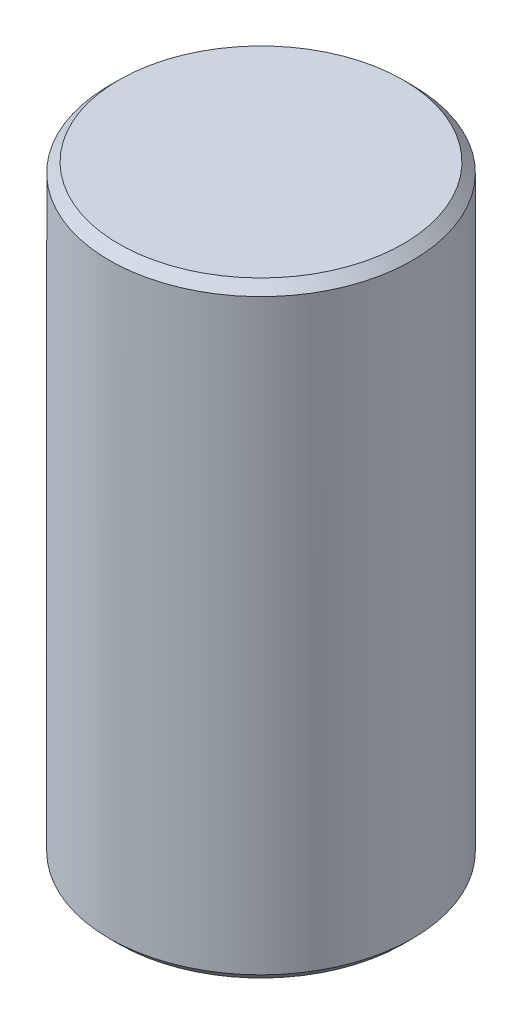
ISO-10303-21;
HEADER;
FILE_DESCRIPTION(('STEP AP214'),'2;1');
FILE_NAME('part.step','',(''),(''),'','','');
FILE_SCHEMA(('AUTOMOTIVE_DESIGN { 1 0 10303 214 1 1 1 1 }'));
ENDSEC;
DATA;
#1=APPLICATION_CONTEXT('core data for automotive mechanical design processes');
#2=APPLICATION_PROTOCOL_DEFINITION('international standard','automotive_design',2000,#1);
#3=PRODUCT_CONTEXT('',#1,'mechanical');
#4=PRODUCT('Part','Part','',(#3));
#5=PRODUCT_RELATED_PRODUCT_CATEGORY('part','',(#4));
#6=PRODUCT_DEFINITION_FORMATION('','',#4);
#7=PRODUCT_DEFINITION_CONTEXT('part definition',#1,'design');
#8=PRODUCT_DEFINITION('design','',#6,#7);
#9=PRODUCT_DEFINITION_SHAPE('','',#8);
#10=(LENGTH_UNIT() NAMED_UNIT(*) SI_UNIT(.MILLI.,.METRE.));
#11=(NAMED_UNIT(*) PLANE_ANGLE_UNIT() SI_UNIT($,.RADIAN.));
#12=(NAMED_UNIT(*) SI_UNIT($,.STERADIAN.) SOLID_ANGLE_UNIT());
#13=UNCERTAINTY_MEASURE_WITH_UNIT(LENGTH_MEASURE(1.E-05),#10,'distance_accuracy_value','');
#14=(GEOMETRIC_REPRESENTATION_CONTEXT(3) GLOBAL_UNCERTAINTY_ASSIGNED_CONTEXT((#13)) GLOBAL_UNIT_ASSIGNED_CONTEXT((#10,
#11,#12)) REPRESENTATION_CONTEXT('',''));
#15=CARTESIAN_POINT('',(0.,0.,0.));
#16=DIRECTION('',(0.,0.,1.));
#17=DIRECTION('',(1.,0.,0.));
#18=AXIS2_PLACEMENT_3D('',#15,#16,#17);
#19=CARTESIAN_POINT('',(0.,25.4,0.));
#20=DIRECTION('',(0.,-1.,0.));
#21=DIRECTION('',(0.,0.,-1.));
#22=AXIS2_PLACEMENT_3D('',#19,#20,#21);
#23=CYLINDRICAL_SURFACE('',#22,6.35);
#24=CARTESIAN_POINT('',(0.,0.396875000000001,0.));
#25=DIRECTION('',(0.,1.,0.));
#26=DIRECTION('',(0.,0.,1.));
#27=AXIS2_PLACEMENT_3D('',#24,#25,#26);
#28=CIRCLE('',#27,6.35);
#29=CARTESIAN_POINT('',(0.,0.396874999999998,-6.35));
#30=VERTEX_POINT('',#29);
#31=EDGE_CURVE('E42',#30,#30,#28,.T.);
#32=CARTESIAN_POINT('',(0.,25.003125,0.));
#33=DIRECTION('',(0.,1.,0.));
#34=DIRECTION('',(0.,0.,1.));
#35=AXIS2_PLACEMENT_3D('',#32,#33,#34);
#36=CIRCLE('',#35,6.35);
#37=CARTESIAN_POINT('',(0.,25.003125,-6.35));
#38=VERTEX_POINT('',#37);
#39=EDGE_CURVE('E46',#38,#38,#36,.F.);
#40=CARTESIAN_POINT('',(0.,0.396874999999998,-6.35));
#41=CARTESIAN_POINT('',(0.,0.653190104166664,-6.35));
#42=CARTESIAN_POINT('',(0.,0.90950520833333,-6.35));
#43=CARTESIAN_POINT('',(0.,1.42213541666666,-6.35));
#44=CARTESIAN_POINT('',(0.,1.67845052083333,-6.35));
#45=CARTESIAN_POINT('',(0.,2.19108072916666,-6.35));
#46=CARTESIAN_POINT('',(0.,2.44739583333333,-6.35));
#47=CARTESIAN_POINT('',(0.,2.96002604166667,-6.35));
#48=CARTESIAN_POINT('',(0.,3.21634114583333,-6.35));
#49=CARTESIAN_POINT('',(0.,3.72897135416666,-6.35));
#50=CARTESIAN_POINT('',(0.,3.98528645833333,-6.35));
#51=CARTESIAN_POINT('',(0.,4.49791666666666,-6.35));
#52=CARTESIAN_POINT('',(0.,4.75423177083333,-6.35));
#53=CARTESIAN_POINT('',(0.,5.26686197916666,-6.35));
#54=CARTESIAN_POINT('',(0.,5.52317708333333,-6.35));
#55=CARTESIAN_POINT('',(0.,6.03580729166666,-6.35));
#56=CARTESIAN_POINT('',(0.,6.29212239583333,-6.35));
#57=CARTESIAN_POINT('',(0.,6.80475260416666,-6.35));
#58=CARTESIAN_POINT('',(0.,7.06106770833333,-6.35));
#59=CARTESIAN_POINT('',(0.,7.57369791666666,-6.35));
#60=CARTESIAN_POINT('',(0.,7.83001302083333,-6.35));
#61=CARTESIAN_POINT('',(0.,8.34264322916666,-6.35));
#62=CARTESIAN_POINT('',(0.,8.59895833333333,-6.35));
#63=CARTESIAN_POINT('',(0.,9.11158854166666,-6.35));
#64=CARTESIAN_POINT('',(0.,9.36790364583333,-6.35));
#65=CARTESIAN_POINT('',(0.,9.88053385416666,-6.35));
#66=CARTESIAN_POINT('',(0.,10.1368489583333,-6.35));
#67=CARTESIAN_POINT('',(0.,10.6494791666667,-6.35));
#68=CARTESIAN_POINT('',(0.,10.9057942708333,-6.35));
#69=CARTESIAN_POINT('',(0.,11.4184244791667,-6.35));
#70=CARTESIAN_POINT('',(0.,11.6747395833333,-6.35));
#71=CARTESIAN_POINT('',(0.,12.1873697916667,-6.35));
#72=CARTESIAN_POINT('',(0.,12.4436848958333,-6.35));
#73=CARTESIAN_POINT('',(0.,12.9563151041667,-6.35));
#74=CARTESIAN_POINT('',(0.,13.2126302083333,-6.35));
#75=CARTESIAN_POINT('',(0.,13.7252604166667,-6.35));
#76=CARTESIAN_POINT('',(0.,13.9815755208333,-6.35));
#77=CARTESIAN_POINT('',(0.,14.4942057291667,-6.35));
#78=CARTESIAN_POINT('',(0.,14.7505208333333,-6.35));
#79=CARTESIAN_POINT('',(0.,15.2631510416667,-6.35));
#80=CARTESIAN_POINT('',(0.,15.5194661458333,-6.35));
#81=CARTESIAN_POINT('',(0.,16.0320963541667,-6.35));
#82=CARTESIAN_POINT('',(0.,16.2884114583333,-6.35));
#83=CARTESIAN_POINT('',(0.,16.8010416666667,-6.35));
#84=CARTESIAN_POINT('',(0.,17.0573567708333,-6.35));
#85=CARTESIAN_POINT('',(0.,17.5699869791667,-6.35));
#86=CARTESIAN_POINT('',(0.,17.8263020833333,-6.35));
#87=CARTESIAN_POINT('',(0.,18.3389322916667,-6.35));
#88=CARTESIAN_POINT('',(0.,18.5952473958333,-6.35));
#89=CARTESIAN_POINT('',(0.,19.1078776041667,-6.35));
#90=CARTESIAN_POINT('',(0.,19.3641927083333,-6.35));
#91=CARTESIAN_POINT('',(0.,19.8768229166667,-6.35));
#92=CARTESIAN_POINT('',(0.,20.1331380208333,-6.35));
#93=CARTESIAN_POINT('',(0.,20.6457682291667,-6.35));
#94=CARTESIAN_POINT('',(0.,20.9020833333333,-6.35));
#95=CARTESIAN_POINT('',(0.,21.4147135416667,-6.35));
#96=CARTESIAN_POINT('',(0.,21.6710286458333,-6.35));
#97=CARTESIAN_POINT('',(0.,22.1836588541667,-6.35));
#98=CARTESIAN_POINT('',(0.,22.4399739583333,-6.35));
#99=CARTESIAN_POINT('',(0.,22.9526041666667,-6.35));
#100=CARTESIAN_POINT('',(0.,23.2089192708333,-6.35));
#101=CARTESIAN_POINT('',(0.,23.7215494791667,-6.35));
#102=CARTESIAN_POINT('',(0.,23.9778645833333,-6.35));
#103=CARTESIAN_POINT('',(0.,24.4904947916667,-6.35));
#104=CARTESIAN_POINT('',(0.,24.7468098958333,-6.35));
#105=CARTESIAN_POINT('',(0.,25.003125,-6.35));
#106=B_SPLINE_CURVE_WITH_KNOTS('',3,(#40,#41,#42,#43,#44,#45,#46,#47,#48,#49,#50,#51,#52,#53,
#54,#55,#56,#57,#58,#59,#60,#61,#62,#63,#64,#65,#66,#67,#68,#69,#70,#71,#72,#73,#74,#75,#76,#77,
#78,#79,#80,#81,#82,#83,#84,#85,#86,#87,#88,#89,#90,#91,#92,#93,#94,#95,#96,#97,#98,#99,#100,
#101,#102,#103,#104,#105),.UNSPECIFIED.,.F.,.F.,(4,2,2,2,2,2,2,2,2,2,2,2,2,2,2,2,2,2,2,2,2,2,2,
2,2,2,2,2,2,2,2,2,4),(0.,0.768945312499998,1.537890625,2.3068359375,3.07578125,3.8447265625,
4.613671875,5.3826171875,6.1515625,6.9205078125,7.689453125,8.4583984375,9.22734375,
9.9962890625,10.765234375,11.5341796875,12.303125,13.0720703125,13.841015625,14.6099609375,
15.37890625,16.1478515625,16.916796875,17.6857421875,18.4546875,19.2236328125,19.992578125,
20.7615234375,21.53046875,22.2994140625,23.068359375,23.8373046875,24.60625),.UNSPECIFIED.);
#107=EDGE_CURVE('BSEAM31',#30,#38,#106,.T.);
#108=ORIENTED_EDGE('',*,*,#31,.T.);
#109=ORIENTED_EDGE('',*,*,#39,.T.);
#110=ORIENTED_EDGE('',*,*,#107,.T.);
#111=ORIENTED_EDGE('',*,*,#107,.F.);
#112=EDGE_LOOP('',(#108,#110,#109,#111));
#113=FACE_BOUND('',#112,.T.);
#114=ADVANCED_FACE('F31',(#113),#23,.T.);
#115=CARTESIAN_POINT('',(0.,25.4,0.));
#116=DIRECTION('',(0.,1.,0.));
#117=DIRECTION('',(0.,0.,1.));
#118=AXIS2_PLACEMENT_3D('',#115,#116,#117);
#119=PLANE('',#118);
#120=CARTESIAN_POINT('',(0.,25.4,0.));
#121=DIRECTION('',(0.,1.,0.));
#122=DIRECTION('',(0.,0.,1.));
#123=AXIS2_PLACEMENT_3D('',#120,#121,#122);
#124=CIRCLE('',#123,5.953125);
#125=CARTESIAN_POINT('',(0.,25.4,-5.95312500000001));
#126=VERTEX_POINT('',#125);
#127=EDGE_CURVE('E10',#126,#126,#124,.T.);
#128=ORIENTED_EDGE('',*,*,#127,.T.);
#129=EDGE_LOOP('',(#128));
#130=FACE_BOUND('',#129,.T.);
#131=ADVANCED_FACE('F62',(#130),#119,.T.);
#132=CARTESIAN_POINT('',(0.,0.,0.));
#133=DIRECTION('',(0.,1.,0.));
#134=DIRECTION('',(0.,0.,1.));
#135=AXIS2_PLACEMENT_3D('',#132,#133,#134);
#136=PLANE('',#135);
#137=CARTESIAN_POINT('',(0.,0.,0.));
#138=DIRECTION('',(0.,1.,0.));
#139=DIRECTION('',(0.,0.,1.));
#140=AXIS2_PLACEMENT_3D('',#137,#138,#139);
#141=CIRCLE('',#140,5.953125);
#142=CARTESIAN_POINT('',(0.,0.,5.953125));
#143=VERTEX_POINT('',#142);
#144=EDGE_CURVE('E38',#143,#143,#141,.F.);
#145=ORIENTED_EDGE('',*,*,#144,.T.);
#146=EDGE_LOOP('',(#145));
#147=FACE_BOUND('',#146,.T.);
#148=ADVANCED_FACE('F59',(#147),#136,.F.);
#149=CARTESIAN_POINT('',(0.,0.396875000000001,0.));
#150=DIRECTION('',(0.,1.,0.));
#151=DIRECTION('',(0.,0.,1.));
#152=AXIS2_PLACEMENT_3D('',#149,#150,#151);
#153=CONICAL_SURFACE('',#152,6.35,0.785398163397449);
#154=ORIENTED_EDGE('',*,*,#144,.F.);
#155=EDGE_LOOP('',(#154));
#156=FACE_BOUND('',#155,.T.);
#157=ORIENTED_EDGE('',*,*,#31,.F.);
#158=EDGE_LOOP('',(#157));
#159=FACE_BOUND('',#158,.T.);
#160=ADVANCED_FACE('F55',(#156,#159),#153,.T.);
#161=CARTESIAN_POINT('',(0.,25.4,0.));
#162=DIRECTION('',(0.,-1.,0.));
#163=DIRECTION('',(0.,0.,-1.));
#164=AXIS2_PLACEMENT_3D('',#161,#162,#163);
#165=CONICAL_SURFACE('',#164,5.953125,0.785398163397442);
#166=CARTESIAN_POINT('',(0.,25.003125,-6.35));
#167=CARTESIAN_POINT('',(0.,25.0072591145833,-6.34586588541667));
#168=CARTESIAN_POINT('',(0.,25.0113932291667,-6.34173177083334));
#169=CARTESIAN_POINT('',(0.,25.0196614583333,-6.33346354166667));
#170=CARTESIAN_POINT('',(0.,25.0237955729167,-6.32932942708333));
#171=CARTESIAN_POINT('',(0.,25.0320638020833,-6.32106119791667));
#172=CARTESIAN_POINT('',(0.,25.0361979166667,-6.31692708333333));
#173=CARTESIAN_POINT('',(0.,25.0444661458333,-6.30865885416667));
#174=CARTESIAN_POINT('',(0.,25.0486002604167,-6.30452473958334));
#175=CARTESIAN_POINT('',(0.,25.0568684895833,-6.29625651041667));
#176=CARTESIAN_POINT('',(0.,25.0610026041667,-6.29212239583333));
#177=CARTESIAN_POINT('',(0.,25.0692708333333,-6.28385416666667));
#178=CARTESIAN_POINT('',(0.,25.0734049479167,-6.27972005208334));
#179=CARTESIAN_POINT('',(0.,25.0816731770833,-6.27145182291667));
#180=CARTESIAN_POINT('',(0.,25.0858072916667,-6.26731770833334));
#181=CARTESIAN_POINT('',(0.,25.0940755208333,-6.25904947916667));
#182=CARTESIAN_POINT('',(0.,25.0982096354167,-6.25491536458333));
#183=CARTESIAN_POINT('',(0.,25.1064778645833,-6.24664713541667));
#184=CARTESIAN_POINT('',(0.,25.1106119791667,-6.24251302083334));
#185=CARTESIAN_POINT('',(0.,25.1188802083333,-6.23424479166667));
#186=CARTESIAN_POINT('',(0.,25.1230143229167,-6.23011067708334));
#187=CARTESIAN_POINT('',(0.,25.1312825520833,-6.22184244791667));
#188=CARTESIAN_POINT('',(0.,25.1354166666667,-6.21770833333334));
#189=CARTESIAN_POINT('',(0.,25.1436848958333,-6.20944010416667));
#190=CARTESIAN_POINT('',(0.,25.1478190104167,-6.20530598958334));
#191=CARTESIAN_POINT('',(0.,25.1560872395833,-6.19703776041667));
#192=CARTESIAN_POINT('',(0.,25.1602213541667,-6.19290364583334));
#193=CARTESIAN_POINT('',(0.,25.1684895833333,-6.18463541666667));
#194=CARTESIAN_POINT('',(0.,25.1726236979167,-6.18050130208334));
#195=CARTESIAN_POINT('',(0.,25.1808919270833,-6.17223307291667));
#196=CARTESIAN_POINT('',(0.,25.1850260416667,-6.16809895833334));
#197=CARTESIAN_POINT('',(0.,25.1932942708333,-6.15983072916667));
#198=CARTESIAN_POINT('',(0.,25.1974283854167,-6.15569661458334));
#199=CARTESIAN_POINT('',(0.,25.2056966145833,-6.14742838541667));
#200=CARTESIAN_POINT('',(0.,25.2098307291667,-6.14329427083334));
#201=CARTESIAN_POINT('',(0.,25.2180989583333,-6.13502604166667));
#202=CARTESIAN_POINT('',(0.,25.2222330729167,-6.13089192708334));
#203=CARTESIAN_POINT('',(0.,25.2305013020833,-6.12262369791667));
#204=CARTESIAN_POINT('',(0.,25.2346354166667,-6.11848958333334));
#205=CARTESIAN_POINT('',(0.,25.2429036458333,-6.11022135416667));
#206=CARTESIAN_POINT('',(0.,25.2470377604167,-6.10608723958334));
#207=CARTESIAN_POINT('',(0.,25.2553059895833,-6.09781901041667));
#208=CARTESIAN_POINT('',(0.,25.2594401041667,-6.09368489583334));
#209=CARTESIAN_POINT('',(0.,25.2677083333333,-6.08541666666667));
#210=CARTESIAN_POINT('',(0.,25.2718424479167,-6.08128255208334));
#211=CARTESIAN_POINT('',(0.,25.2801106770833,-6.07301432291667));
#212=CARTESIAN_POINT('',(0.,25.2842447916667,-6.06888020833334));
#213=CARTESIAN_POINT('',(0.,25.2925130208333,-6.06061197916667));
#214=CARTESIAN_POINT('',(0.,25.2966471354167,-6.05647786458334));
#215=CARTESIAN_POINT('',(0.,25.3049153645833,-6.04820963541667));
#216=CARTESIAN_POINT('',(0.,25.3090494791667,-6.04407552083334));
#217=CARTESIAN_POINT('',(0.,25.3173177083333,-6.03580729166667));
#218=CARTESIAN_POINT('',(0.,25.3214518229167,-6.03167317708334));
#219=CARTESIAN_POINT('',(0.,25.3297200520833,-6.02340494791667));
#220=CARTESIAN_POINT('',(0.,25.3338541666667,-6.01927083333334));
#221=CARTESIAN_POINT('',(0.,25.3421223958333,-6.01100260416667));
#222=CARTESIAN_POINT('',(0.,25.3462565104167,-6.00686848958334));
#223=CARTESIAN_POINT('',(0.,25.3545247395833,-5.99860026041667));
#224=CARTESIAN_POINT('',(0.,25.3586588541667,-5.99446614583334));
#225=CARTESIAN_POINT('',(0.,25.3669270833333,-5.98619791666667));
#226=CARTESIAN_POINT('',(0.,25.3710611979167,-5.98206380208334));
#227=CARTESIAN_POINT('',(0.,25.3793294270833,-5.97379557291667));
#228=CARTESIAN_POINT('',(0.,25.3834635416667,-5.96966145833334));
#229=CARTESIAN_POINT('',(0.,25.3917317708333,-5.96139322916667));
#230=CARTESIAN_POINT('',(0.,25.3958658854167,-5.95725911458334));
#231=CARTESIAN_POINT('',(0.,25.4,-5.95312500000001));
#232=B_SPLINE_CURVE_WITH_KNOTS('',3,(#166,#167,#168,#169,#170,#171,#172,#173,#174,#175,#176,
#177,#178,#179,#180,#181,#182,#183,#184,#185,#186,#187,#188,#189,#190,#191,#192,#193,#194,#195,
#196,#197,#198,#199,#200,#201,#202,#203,#204,#205,#206,#207,#208,#209,#210,#211,#212,#213,#214,
#215,#216,#217,#218,#219,#220,#221,#222,#223,#224,#225,#226,#227,#228,#229,#230,#231),
.UNSPECIFIED.,.F.,.F.,(4,2,2,2,2,2,2,2,2,2,2,2,2,2,2,2,2,2,2,2,2,2,2,2,2,2,2,2,2,2,2,2,4),(0.,
0.0175395627364622,0.0350791254729244,0.0526186882093896,0.0701582509458518,0.087697813682314,
0.105237376418779,0.122776939155241,0.140316501891704,0.157856064628168,0.17539562736463,
0.192935190101093,0.210474752837557,0.228014315574019,0.245553878310482,0.263093441046947,
0.280633003783409,0.298172566519871,0.315712129256336,0.333251691992799,0.350791254729261,
0.368330817465725,0.385870380202188,0.40340994293865,0.420949505675115,0.438489068411577,
0.45602863114804,0.473568193884504,0.491107756620966,0.508647319357428,0.526186882093894,
0.543726444830356,0.561266007566821),.UNSPECIFIED.);
#233=EDGE_CURVE('BSEAM33',#38,#126,#232,.T.);
#234=ORIENTED_EDGE('',*,*,#39,.F.);
#235=ORIENTED_EDGE('',*,*,#127,.F.);
#236=ORIENTED_EDGE('',*,*,#233,.T.);
#237=ORIENTED_EDGE('',*,*,#233,.F.);
#238=EDGE_LOOP('',(#234,#236,#235,#237));
#239=FACE_BOUND('',#238,.T.);
#240=ADVANCED_FACE('F33',(#239),#165,.T.);
#241=CLOSED_SHELL('',(#114,#131,#148,#160,#240));
#242=MANIFOLD_SOLID_BREP('B2',#241);
#243=ADVANCED_BREP_SHAPE_REPRESENTATION('',(#18,#242),#14);
#244=SHAPE_DEFINITION_REPRESENTATION(#9,#243);
ENDSEC;
END-ISO-10303-21;
